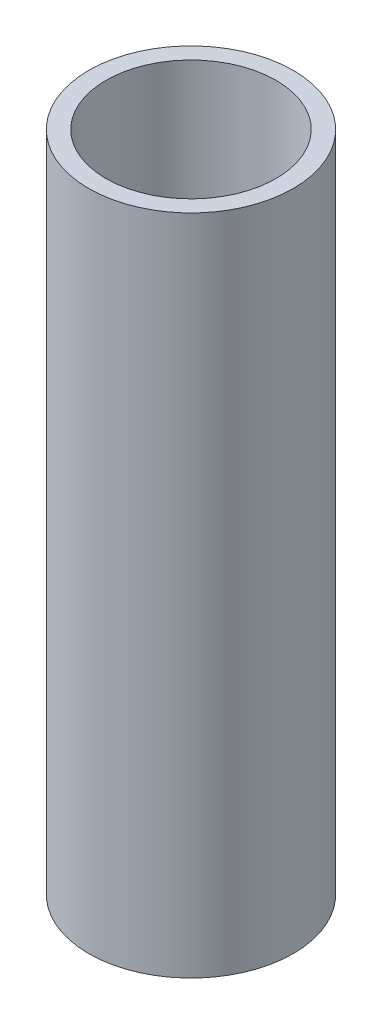
ISO-10303-21;
HEADER;
FILE_DESCRIPTION(('STEP AP214'),'2;1');
FILE_NAME('part.step','',(''),(''),'','','');
FILE_SCHEMA(('AUTOMOTIVE_DESIGN { 1 0 10303 214 1 1 1 1 }'));
ENDSEC;
DATA;
#1=APPLICATION_CONTEXT('core data for automotive mechanical design processes');
#2=APPLICATION_PROTOCOL_DEFINITION('international standard','automotive_design',2000,#1);
#3=PRODUCT_CONTEXT('',#1,'mechanical');
#4=PRODUCT('Part','Part','',(#3));
#5=PRODUCT_RELATED_PRODUCT_CATEGORY('part','',(#4));
#6=PRODUCT_DEFINITION_FORMATION('','',#4);
#7=PRODUCT_DEFINITION_CONTEXT('part definition',#1,'design');
#8=PRODUCT_DEFINITION('design','',#6,#7);
#9=PRODUCT_DEFINITION_SHAPE('','',#8);
#10=(LENGTH_UNIT() NAMED_UNIT(*) SI_UNIT(.MILLI.,.METRE.));
#11=(NAMED_UNIT(*) PLANE_ANGLE_UNIT() SI_UNIT($,.RADIAN.));
#12=(NAMED_UNIT(*) SI_UNIT($,.STERADIAN.) SOLID_ANGLE_UNIT());
#13=UNCERTAINTY_MEASURE_WITH_UNIT(LENGTH_MEASURE(1.E-05),#10,'distance_accuracy_value','');
#14=(GEOMETRIC_REPRESENTATION_CONTEXT(3) GLOBAL_UNCERTAINTY_ASSIGNED_CONTEXT((#13)) GLOBAL_UNIT_ASSIGNED_CONTEXT((#10,
#11,#12)) REPRESENTATION_CONTEXT('',''));
#15=CARTESIAN_POINT('',(0.,0.,0.));
#16=DIRECTION('',(0.,0.,1.));
#17=DIRECTION('',(1.,0.,0.));
#18=AXIS2_PLACEMENT_3D('',#15,#16,#17);
#19=CARTESIAN_POINT('',(0.,136.525,0.));
#20=DIRECTION('',(0.,1.,0.));
#21=DIRECTION('',(0.,0.,1.));
#22=AXIS2_PLACEMENT_3D('',#19,#20,#21);
#23=PLANE('',#22);
#24=CARTESIAN_POINT('',(0.,136.525,0.));
#25=DIRECTION('',(0.,1.,0.));
#26=DIRECTION('',(0.,0.,1.));
#27=AXIS2_PLACEMENT_3D('',#24,#25,#26);
#28=CIRCLE('',#27,21.082);
#29=CARTESIAN_POINT('',(0.,136.525,21.082));
#30=VERTEX_POINT('',#29);
#31=EDGE_CURVE('E12',#30,#30,#28,.T.);
#32=ORIENTED_EDGE('',*,*,#31,.T.);
#33=EDGE_LOOP('',(#32));
#34=FACE_BOUND('',#33,.T.);
#35=CARTESIAN_POINT('',(0.,136.525,0.));
#36=DIRECTION('',(0.,1.,0.));
#37=DIRECTION('',(0.,0.,1.));
#38=AXIS2_PLACEMENT_3D('',#35,#36,#37);
#39=CIRCLE('',#38,17.526);
#40=CARTESIAN_POINT('',(0.,136.525,17.526));
#41=VERTEX_POINT('',#40);
#42=EDGE_CURVE('E49',#41,#41,#39,.T.);
#43=ORIENTED_EDGE('',*,*,#42,.F.);
#44=EDGE_LOOP('',(#43));
#45=FACE_BOUND('',#44,.T.);
#46=ADVANCED_FACE('F38',(#34,#45),#23,.T.);
#47=CARTESIAN_POINT('',(0.,0.,0.));
#48=DIRECTION('',(0.,1.,0.));
#49=DIRECTION('',(0.,0.,1.));
#50=AXIS2_PLACEMENT_3D('',#47,#48,#49);
#51=PLANE('',#50);
#52=CARTESIAN_POINT('',(0.,0.,0.));
#53=DIRECTION('',(0.,1.,0.));
#54=DIRECTION('',(0.,0.,1.));
#55=AXIS2_PLACEMENT_3D('',#52,#53,#54);
#56=CIRCLE('',#55,21.082);
#57=CARTESIAN_POINT('',(0.,0.,21.082));
#58=VERTEX_POINT('',#57);
#59=EDGE_CURVE('E42',#58,#58,#56,.T.);
#60=ORIENTED_EDGE('',*,*,#59,.F.);
#61=EDGE_LOOP('',(#60));
#62=FACE_BOUND('',#61,.T.);
#63=CARTESIAN_POINT('',(0.,0.,0.));
#64=DIRECTION('',(0.,1.,0.));
#65=DIRECTION('',(0.,0.,1.));
#66=AXIS2_PLACEMENT_3D('',#63,#64,#65);
#67=CIRCLE('',#66,17.526);
#68=CARTESIAN_POINT('',(0.,0.,17.526));
#69=VERTEX_POINT('',#68);
#70=EDGE_CURVE('E51',#69,#69,#67,.T.);
#71=ORIENTED_EDGE('',*,*,#70,.T.);
#72=EDGE_LOOP('',(#71));
#73=FACE_BOUND('',#72,.T.);
#74=ADVANCED_FACE('F61',(#62,#73),#51,.F.);
#75=CARTESIAN_POINT('',(0.,136.525,0.));
#76=DIRECTION('',(0.,-1.,0.));
#77=DIRECTION('',(0.,0.,-1.));
#78=AXIS2_PLACEMENT_3D('',#75,#76,#77);
#79=CYLINDRICAL_SURFACE('',#78,21.082);
#80=ORIENTED_EDGE('',*,*,#31,.F.);
#81=EDGE_LOOP('',(#80));
#82=FACE_BOUND('',#81,.T.);
#83=ORIENTED_EDGE('',*,*,#59,.T.);
#84=EDGE_LOOP('',(#83));
#85=FACE_BOUND('',#84,.T.);
#86=ADVANCED_FACE('F40',(#82,#85),#79,.T.);
#87=CARTESIAN_POINT('',(0.,136.525,0.));
#88=DIRECTION('',(0.,-1.,0.));
#89=DIRECTION('',(0.,0.,-1.));
#90=AXIS2_PLACEMENT_3D('',#87,#88,#89);
#91=CYLINDRICAL_SURFACE('',#90,17.526);
#92=ORIENTED_EDGE('',*,*,#42,.T.);
#93=EDGE_LOOP('',(#92));
#94=FACE_BOUND('',#93,.T.);
#95=ORIENTED_EDGE('',*,*,#70,.F.);
#96=EDGE_LOOP('',(#95));
#97=FACE_BOUND('',#96,.T.);
#98=ADVANCED_FACE('F57',(#94,#97),#91,.F.);
#99=CLOSED_SHELL('',(#46,#74,#86,#98));
#100=MANIFOLD_SOLID_BREP('B2',#99);
#101=ADVANCED_BREP_SHAPE_REPRESENTATION('',(#18,#100),#14);
#102=SHAPE_DEFINITION_REPRESENTATION(#9,#101);
ENDSEC;
END-ISO-10303-21;
